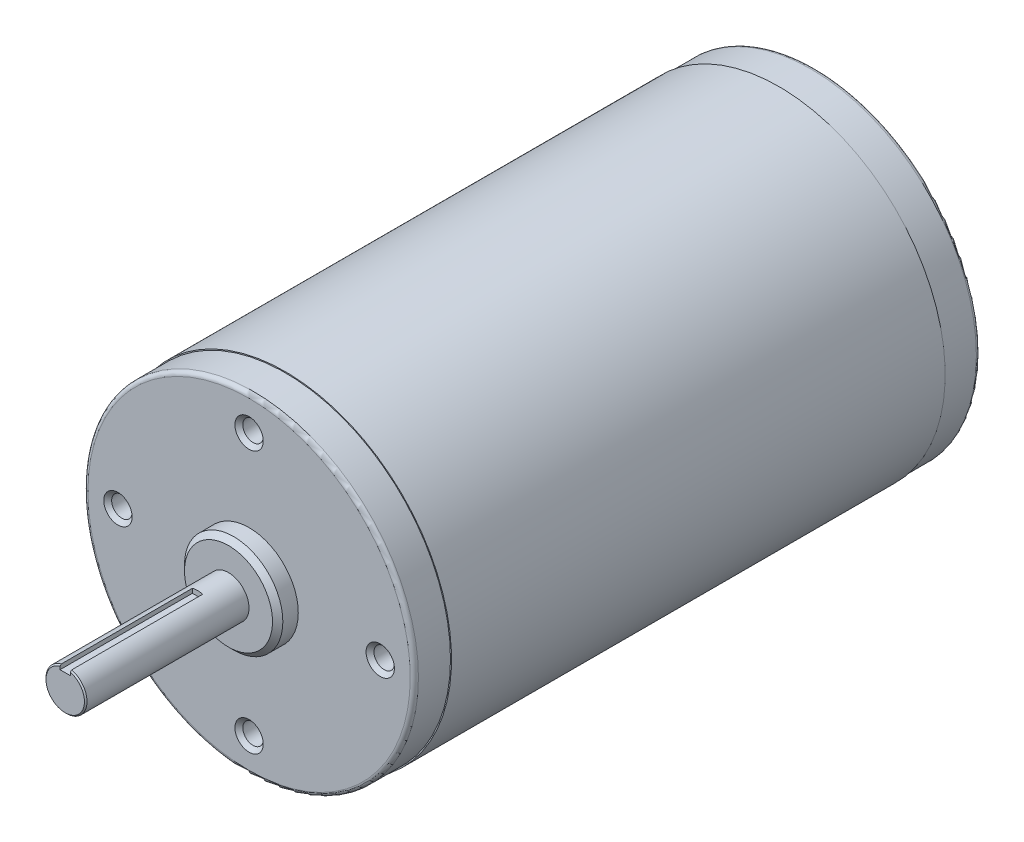
ISO-10303-21;
HEADER;
FILE_DESCRIPTION(('STEP AP214'),'2;1');
FILE_NAME('part.step','',(''),(''),'','','');
FILE_SCHEMA(('AUTOMOTIVE_DESIGN { 1 0 10303 214 1 1 1 1 }'));
ENDSEC;
DATA;
#1=APPLICATION_CONTEXT('core data for automotive mechanical design processes');
#2=APPLICATION_PROTOCOL_DEFINITION('international standard','automotive_design',2000,#1);
#3=PRODUCT_CONTEXT('',#1,'mechanical');
#4=PRODUCT('Part','Part','',(#3));
#5=PRODUCT_RELATED_PRODUCT_CATEGORY('part','',(#4));
#6=PRODUCT_DEFINITION_FORMATION('','',#4);
#7=PRODUCT_DEFINITION_CONTEXT('part definition',#1,'design');
#8=PRODUCT_DEFINITION('design','',#6,#7);
#9=PRODUCT_DEFINITION_SHAPE('','',#8);
#10=(LENGTH_UNIT() NAMED_UNIT(*) SI_UNIT(.MILLI.,.METRE.));
#11=(NAMED_UNIT(*) PLANE_ANGLE_UNIT() SI_UNIT($,.RADIAN.));
#12=(NAMED_UNIT(*) SI_UNIT($,.STERADIAN.) SOLID_ANGLE_UNIT());
#13=UNCERTAINTY_MEASURE_WITH_UNIT(LENGTH_MEASURE(1.E-05),#10,'distance_accuracy_value','');
#14=(GEOMETRIC_REPRESENTATION_CONTEXT(3) GLOBAL_UNCERTAINTY_ASSIGNED_CONTEXT((#13)) GLOBAL_UNIT_ASSIGNED_CONTEXT((#10,
#11,#12)) REPRESENTATION_CONTEXT('',''));
#15=CARTESIAN_POINT('',(0.,0.,0.));
#16=DIRECTION('',(0.,0.,1.));
#17=DIRECTION('',(1.,0.,0.));
#18=AXIS2_PLACEMENT_3D('',#15,#16,#17);
#19=CARTESIAN_POINT('',(-1.,3.,42.6108));
#20=DIRECTION('',(0.,1.,0.));
#21=DIRECTION('',(0.,0.,1.));
#22=AXIS2_PLACEMENT_3D('',#19,#20,#21);
#23=PLANE('',#22);
#24=DIRECTION('',(1.,0.,0.));
#25=VECTOR('',#24,1.);
#26=CARTESIAN_POINT('',(0.,3.,42.6108));
#27=LINE('',#26,#25);
#28=CARTESIAN_POINT('',(1.,3.,42.6108));
#29=VERTEX_POINT('',#28);
#30=CARTESIAN_POINT('',(-1.,3.,42.6107999999886));
#31=VERTEX_POINT('',#30);
#32=EDGE_CURVE('E135',#29,#31,#27,.F.);
#33=ORIENTED_EDGE('',*,*,#32,.F.);
#34=DIRECTION('',(0.,0.,1.));
#35=VECTOR('',#34,1.);
#36=CARTESIAN_POINT('',(1.,3.,42.6108));
#37=LINE('',#36,#35);
#38=CARTESIAN_POINT('',(1.,3.,16.9822));
#39=VERTEX_POINT('',#38);
#40=EDGE_CURVE('E132',#39,#29,#37,.T.);
#41=ORIENTED_EDGE('',*,*,#40,.F.);
#42=DIRECTION('',(1.,0.,0.));
#43=VECTOR('',#42,1.);
#44=CARTESIAN_POINT('',(0.,3.,16.9822));
#45=LINE('',#44,#43);
#46=CARTESIAN_POINT('',(-0.999999999999372,3.,16.9822));
#47=VERTEX_POINT('',#46);
#48=EDGE_CURVE('E112',#47,#39,#45,.T.);
#49=ORIENTED_EDGE('',*,*,#48,.F.);
#50=DIRECTION('',(0.,0.,-1.));
#51=VECTOR('',#50,1.);
#52=CARTESIAN_POINT('',(-1.,3.,42.6108));
#53=LINE('',#52,#51);
#54=EDGE_CURVE('E113',#31,#47,#53,.T.);
#55=ORIENTED_EDGE('',*,*,#54,.F.);
#56=EDGE_LOOP('',(#33,#41,#49,#55));
#57=FACE_BOUND('',#56,.T.);
#58=ADVANCED_FACE('F17',(#57),#23,.T.);
#59=CARTESIAN_POINT('',(0.,0.,42.6108));
#60=DIRECTION('',(0.,0.,1.));
#61=DIRECTION('',(1.,0.,0.));
#62=AXIS2_PLACEMENT_3D('',#59,#60,#61);
#63=PLANE('',#62);
#64=DIRECTION('',(0.,1.,0.));
#65=VECTOR('',#64,1.);
#66=CARTESIAN_POINT('',(-1.,3.84726136491921,42.6107999999829));
#67=LINE('',#66,#65);
#68=CARTESIAN_POINT('',(-1.,3.58836592481583,42.61079999998));
#69=VERTEX_POINT('',#68);
#70=EDGE_CURVE('E137',#69,#31,#67,.F.);
#71=ORIENTED_EDGE('',*,*,#70,.F.);
#72=CARTESIAN_POINT('',(0.,0.,42.6107999999772));
#73=DIRECTION('',(0.,0.,-1.));
#74=DIRECTION('',(-1.,0.,0.));
#75=AXIS2_PLACEMENT_3D('',#72,#73,#74);
#76=CIRCLE('',#75,3.72510000005377);
#77=CARTESIAN_POINT('',(1.,3.58836592480695,42.6107999999886));
#78=VERTEX_POINT('',#77);
#79=EDGE_CURVE('E108',#78,#69,#76,.T.);
#80=ORIENTED_EDGE('',*,*,#79,.F.);
#81=DIRECTION('',(0.,1.,0.));
#82=VECTOR('',#81,1.);
#83=CARTESIAN_POINT('',(1.,3.,42.6108));
#84=LINE('',#83,#82);
#85=EDGE_CURVE('E129',#29,#78,#84,.T.);
#86=ORIENTED_EDGE('',*,*,#85,.F.);
#87=ORIENTED_EDGE('',*,*,#32,.T.);
#88=EDGE_LOOP('',(#71,#80,#86,#87));
#89=FACE_BOUND('',#88,.T.);
#90=ADVANCED_FACE('F235',(#89),#63,.T.);
#91=CARTESIAN_POINT('',(-1.,3.84726136491921,42.6108));
#92=DIRECTION('',(1.,0.,0.));
#93=DIRECTION('',(0.,0.,-1.));
#94=AXIS2_PLACEMENT_3D('',#91,#92,#93);
#95=PLANE('',#94);
#96=DIRECTION('',(0.,0.,1.));
#97=VECTOR('',#96,1.);
#98=CARTESIAN_POINT('',(-0.999999999997144,3.84726136491995,10.9878));
#99=LINE('',#98,#97);
#100=CARTESIAN_POINT('',(-0.999999999998572,3.84726136492551,42.3608000000137));
#101=VERTEX_POINT('',#100);
#102=CARTESIAN_POINT('',(-0.999999999998101,3.8472613649197,16.9822));
#103=VERTEX_POINT('',#102);
#104=EDGE_CURVE('E97',#101,#103,#99,.F.);
#105=ORIENTED_EDGE('',*,*,#104,.F.);
#106=CARTESIAN_POINT('',(-1.,3.84726136493107,42.3608000000195));
#107=CARTESIAN_POINT('',(-1.,3.80416108609737,42.4025173690236));
#108=CARTESIAN_POINT('',(-1.,3.76103632691273,42.4442093866227));
#109=CARTESIAN_POINT('',(-1.,3.67473784687433,42.5275427199451));
#110=CARTESIAN_POINT('',(-1.,3.63156412601948,42.5691840356672));
#111=CARTESIAN_POINT('',(-1.,3.58836592481258,42.6107999999832));
#112=B_SPLINE_CURVE_WITH_KNOTS('',3,(#106,#107,#108,#109,#110,#111),.UNSPECIFIED.,.F.,.F.,(4,2,
4),(0.,0.179949222493419,0.35989844902044),.UNSPECIFIED.);
#113=EDGE_CURVE('E106',#101,#69,#112,.T.);
#114=ORIENTED_EDGE('',*,*,#113,.T.);
#115=ORIENTED_EDGE('',*,*,#70,.T.);
#116=ORIENTED_EDGE('',*,*,#54,.T.);
#117=DIRECTION('',(0.,-1.,0.));
#118=VECTOR('',#117,1.);
#119=CARTESIAN_POINT('',(-0.999999999999058,3.45234055060211,16.9822));
#120=LINE('',#119,#118);
#121=EDGE_CURVE('E118',#103,#47,#120,.T.);
#122=ORIENTED_EDGE('',*,*,#121,.F.);
#123=EDGE_LOOP('',(#105,#114,#115,#116,#122));
#124=FACE_BOUND('',#123,.T.);
#125=ADVANCED_FACE('F115',(#124),#95,.T.);
#126=CARTESIAN_POINT('',(0.,3.45234055060211,16.9822));
#127=DIRECTION('',(0.,0.,1.));
#128=DIRECTION('',(0.,-1.,0.));
#129=AXIS2_PLACEMENT_3D('',#126,#127,#128);
#130=PLANE('',#129);
#131=CARTESIAN_POINT('',(0.,0.,16.9822));
#132=DIRECTION('',(0.,0.,1.));
#133=DIRECTION('',(1.,0.,0.));
#134=AXIS2_PLACEMENT_3D('',#131,#132,#133);
#135=CIRCLE('',#134,3.9751);
#136=CARTESIAN_POINT('',(1.,3.84726136491921,16.9822));
#137=VERTEX_POINT('',#136);
#138=EDGE_CURVE('E120',#103,#137,#135,.F.);
#139=ORIENTED_EDGE('',*,*,#138,.F.);
#140=ORIENTED_EDGE('',*,*,#121,.T.);
#141=ORIENTED_EDGE('',*,*,#48,.T.);
#142=DIRECTION('',(0.,1.,0.));
#143=VECTOR('',#142,1.);
#144=CARTESIAN_POINT('',(1.,3.,16.9822));
#145=LINE('',#144,#143);
#146=EDGE_CURVE('E142',#137,#39,#145,.F.);
#147=ORIENTED_EDGE('',*,*,#146,.F.);
#148=EDGE_LOOP('',(#139,#140,#141,#147));
#149=FACE_BOUND('',#148,.T.);
#150=ADVANCED_FACE('F228',(#149),#130,.T.);
#151=CARTESIAN_POINT('',(1.,3.,42.6108));
#152=DIRECTION('',(-1.,0.,0.));
#153=DIRECTION('',(0.,0.,1.));
#154=AXIS2_PLACEMENT_3D('',#151,#152,#153);
#155=PLANE('',#154);
#156=ORIENTED_EDGE('',*,*,#85,.T.);
#157=CARTESIAN_POINT('',(1.,3.84726136494984,42.3608000000013));
#158=CARTESIAN_POINT('',(1.,3.80416108611283,42.4025173690086));
#159=CARTESIAN_POINT('',(1.,3.76103632692487,42.444209386611));
#160=CARTESIAN_POINT('',(1.,3.67473784687983,42.5275427199398));
#161=CARTESIAN_POINT('',(1.,3.63156412602165,42.5691840356651));
#162=CARTESIAN_POINT('',(1.,3.58836592481142,42.6107999999843));
#163=B_SPLINE_CURVE_WITH_KNOTS('',3,(#157,#158,#159,#160,#161,#162),.UNSPECIFIED.,.F.,.F.,(4,2,
4),(0.,0.179949222507292,0.359898449048175),.UNSPECIFIED.);
#164=CARTESIAN_POINT('',(1.,3.84726136493452,42.3608000000032));
#165=VERTEX_POINT('',#164);
#166=EDGE_CURVE('E121',#165,#78,#163,.T.);
#167=ORIENTED_EDGE('',*,*,#166,.F.);
#168=DIRECTION('',(0.,0.,1.));
#169=VECTOR('',#168,1.);
#170=CARTESIAN_POINT('',(1.,3.84726136491921,10.9878));
#171=LINE('',#170,#169);
#172=EDGE_CURVE('E99',#137,#165,#171,.T.);
#173=ORIENTED_EDGE('',*,*,#172,.F.);
#174=ORIENTED_EDGE('',*,*,#146,.T.);
#175=ORIENTED_EDGE('',*,*,#40,.T.);
#176=EDGE_LOOP('',(#156,#167,#173,#174,#175));
#177=FACE_BOUND('',#176,.T.);
#178=ADVANCED_FACE('F224',(#177),#155,.T.);
#179=CARTESIAN_POINT('',(0.,0.,42.3608000000399));
#180=DIRECTION('',(0.,0.,-1.));
#181=DIRECTION('',(-1.,0.,0.));
#182=AXIS2_PLACEMENT_3D('',#179,#180,#181);
#183=CONICAL_SURFACE('',#182,3.97509999999102,0.785398163397448);
#184=CARTESIAN_POINT('',(0.,0.,42.3608000000051));
#185=DIRECTION('',(0.,0.,1.));
#186=DIRECTION('',(1.,0.,0.));
#187=AXIS2_PLACEMENT_3D('',#184,#185,#186);
#188=CIRCLE('',#187,3.9751);
#189=EDGE_CURVE('E91',#165,#101,#188,.F.);
#190=ORIENTED_EDGE('',*,*,#189,.F.);
#191=ORIENTED_EDGE('',*,*,#166,.T.);
#192=ORIENTED_EDGE('',*,*,#79,.T.);
#193=ORIENTED_EDGE('',*,*,#113,.F.);
#194=EDGE_LOOP('',(#190,#191,#192,#193));
#195=FACE_BOUND('',#194,.T.);
#196=ADVANCED_FACE('F107',(#195),#183,.T.);
#197=CARTESIAN_POINT('',(0.,0.,10.9878));
#198=DIRECTION('',(0.,0.,1.));
#199=DIRECTION('',(1.,0.,0.));
#200=AXIS2_PLACEMENT_3D('',#197,#198,#199);
#201=CYLINDRICAL_SURFACE('',#200,3.9751);
#202=ORIENTED_EDGE('',*,*,#189,.T.);
#203=ORIENTED_EDGE('',*,*,#104,.T.);
#204=ORIENTED_EDGE('',*,*,#138,.T.);
#205=ORIENTED_EDGE('',*,*,#172,.T.);
#206=EDGE_LOOP('',(#202,#203,#204,#205));
#207=FACE_BOUND('',#206,.T.);
#208=CARTESIAN_POINT('',(0.,0.,10.9878));
#209=DIRECTION('',(0.,0.,1.));
#210=DIRECTION('',(1.,0.,0.));
#211=AXIS2_PLACEMENT_3D('',#208,#209,#210);
#212=CIRCLE('',#211,3.9751);
#213=CARTESIAN_POINT('',(3.9751,0.,10.9878));
#214=VERTEX_POINT('',#213);
#215=EDGE_CURVE('E214',#214,#214,#212,.F.);
#216=ORIENTED_EDGE('',*,*,#215,.F.);
#217=EDGE_LOOP('',(#216));
#218=FACE_BOUND('',#217,.T.);
#219=ADVANCED_FACE('F93',(#207,#218),#201,.T.);
#220=CARTESIAN_POINT('',(0.,-25.4,-98.7956));
#221=DIRECTION('',(0.,0.,-1.));
#222=DIRECTION('',(-1.,0.,0.));
#223=AXIS2_PLACEMENT_3D('',#220,#221,#222);
#224=CYLINDRICAL_SURFACE('',#223,2.54);
#225=CARTESIAN_POINT('',(0.,-25.4,-94.9856000000295));
#226=DIRECTION('',(0.,0.,-1.));
#227=DIRECTION('',(0.,1.,0.));
#228=AXIS2_PLACEMENT_3D('',#225,#226,#227);
#229=CIRCLE('',#228,2.54000000013357);
#230=CARTESIAN_POINT('',(0.,-22.8599999998664,-94.9856000000295));
#231=VERTEX_POINT('',#230);
#232=EDGE_CURVE('E213',#231,#231,#229,.F.);
#233=ORIENTED_EDGE('',*,*,#232,.T.);
#234=EDGE_LOOP('',(#233));
#235=FACE_BOUND('',#234,.T.);
#236=CARTESIAN_POINT('',(0.,-25.4,-98.0336));
#237=DIRECTION('',(0.,0.,-1.));
#238=DIRECTION('',(-1.,0.,0.));
#239=AXIS2_PLACEMENT_3D('',#236,#237,#238);
#240=CIRCLE('',#239,2.54);
#241=CARTESIAN_POINT('',(-2.54,-25.4,-98.0336));
#242=VERTEX_POINT('',#241);
#243=EDGE_CURVE('E210',#242,#242,#240,.T.);
#244=ORIENTED_EDGE('',*,*,#243,.T.);
#245=EDGE_LOOP('',(#244));
#246=FACE_BOUND('',#245,.T.);
#247=ADVANCED_FACE('F734',(#235,#246),#224,.F.);
#248=CARTESIAN_POINT('',(0.,25.4,-98.7956));
#249=DIRECTION('',(0.,0.,-1.));
#250=DIRECTION('',(-1.,0.,0.));
#251=AXIS2_PLACEMENT_3D('',#248,#249,#250);
#252=CYLINDRICAL_SURFACE('',#251,2.54);
#253=CARTESIAN_POINT('',(0.,25.4,-94.9855999999727));
#254=DIRECTION('',(0.,0.,-1.));
#255=DIRECTION('',(-1.,0.,0.));
#256=AXIS2_PLACEMENT_3D('',#253,#254,#255);
#257=CIRCLE('',#256,2.53999999995358);
#258=CARTESIAN_POINT('',(-2.53999999995358,25.4,-94.9855999999727));
#259=VERTEX_POINT('',#258);
#260=EDGE_CURVE('E102',#259,#259,#257,.F.);
#261=ORIENTED_EDGE('',*,*,#260,.T.);
#262=EDGE_LOOP('',(#261));
#263=FACE_BOUND('',#262,.T.);
#264=CARTESIAN_POINT('',(0.,25.4,-98.0336));
#265=DIRECTION('',(0.,0.,-1.));
#266=DIRECTION('',(-1.,0.,0.));
#267=AXIS2_PLACEMENT_3D('',#264,#265,#266);
#268=CIRCLE('',#267,2.54);
#269=CARTESIAN_POINT('',(-2.54,25.4,-98.0336));
#270=VERTEX_POINT('',#269);
#271=EDGE_CURVE('E207',#270,#270,#268,.T.);
#272=ORIENTED_EDGE('',*,*,#271,.T.);
#273=EDGE_LOOP('',(#272));
#274=FACE_BOUND('',#273,.T.);
#275=ADVANCED_FACE('F725',(#263,#274),#252,.F.);
#276=CARTESIAN_POINT('',(0.,25.4,-94.9855999999727));
#277=DIRECTION('',(0.,0.,-1.));
#278=DIRECTION('',(0.,1.,0.));
#279=AXIS2_PLACEMENT_3D('',#276,#277,#278);
#280=CONICAL_SURFACE('',#279,2.53999999995358,1.02974425872309);
#281=CARTESIAN_POINT('',(0.,25.4,-94.6498390860874));
#282=DIRECTION('',(0.,0.,1.));
#283=DIRECTION('',(1.,0.,0.));
#284=AXIS2_PLACEMENT_3D('',#281,#282,#283);
#285=CIRCLE('',#284,1.9812);
#286=CARTESIAN_POINT('',(1.98120000000001,25.4,-94.6498390860874));
#287=VERTEX_POINT('',#286);
#288=EDGE_CURVE('E206',#287,#287,#285,.T.);
#289=ORIENTED_EDGE('',*,*,#288,.T.);
#290=EDGE_LOOP('',(#289));
#291=FACE_BOUND('',#290,.T.);
#292=ORIENTED_EDGE('',*,*,#260,.F.);
#293=EDGE_LOOP('',(#292));
#294=FACE_BOUND('',#293,.T.);
#295=ADVANCED_FACE('F716',(#291,#294),#280,.F.);
#296=CARTESIAN_POINT('',(0.,0.,-95.6056));
#297=DIRECTION('',(0.,0.,1.));
#298=DIRECTION('',(1.,0.,0.));
#299=AXIS2_PLACEMENT_3D('',#296,#297,#298);
#300=PLANE('',#299);
#301=CARTESIAN_POINT('',(25.4,0.,-95.6056));
#302=DIRECTION('',(0.,0.,1.));
#303=DIRECTION('',(1.,0.,0.));
#304=AXIS2_PLACEMENT_3D('',#301,#302,#303);
#305=CIRCLE('',#304,1.9812);
#306=CARTESIAN_POINT('',(27.3812,0.,-95.6056));
#307=VERTEX_POINT('',#306);
#308=EDGE_CURVE('E203',#307,#307,#305,.T.);
#309=ORIENTED_EDGE('',*,*,#308,.T.);
#310=EDGE_LOOP('',(#309));
#311=FACE_BOUND('',#310,.T.);
#312=ADVANCED_FACE('F707',(#311),#300,.T.);
#313=CARTESIAN_POINT('',(0.,0.,10.9878));
#314=DIRECTION('',(0.,0.,1.));
#315=DIRECTION('',(1.,0.,0.));
#316=AXIS2_PLACEMENT_3D('',#313,#314,#315);
#317=PLANE('',#316);
#318=CARTESIAN_POINT('',(0.,0.,10.9878));
#319=DIRECTION('',(0.,0.,-1.));
#320=DIRECTION('',(-1.,0.,0.));
#321=AXIS2_PLACEMENT_3D('',#318,#319,#320);
#322=CIRCLE('',#321,8.525);
#323=CARTESIAN_POINT('',(-8.525,0.,10.9878));
#324=VERTEX_POINT('',#323);
#325=EDGE_CURVE('E199',#324,#324,#322,.T.);
#326=ORIENTED_EDGE('',*,*,#325,.F.);
#327=EDGE_LOOP('',(#326));
#328=FACE_BOUND('',#327,.T.);
#329=ORIENTED_EDGE('',*,*,#215,.T.);
#330=EDGE_LOOP('',(#329));
#331=FACE_BOUND('',#330,.T.);
#332=ADVANCED_FACE('F698',(#328,#331),#317,.T.);
#333=CARTESIAN_POINT('',(0.,-25.4,-94.9856000000295));
#334=DIRECTION('',(0.,0.,-1.));
#335=DIRECTION('',(0.,1.,0.));
#336=AXIS2_PLACEMENT_3D('',#333,#334,#335);
#337=CONICAL_SURFACE('',#336,2.54000000013357,1.02974425854376);
#338=ORIENTED_EDGE('',*,*,#232,.F.);
#339=EDGE_LOOP('',(#338));
#340=FACE_BOUND('',#339,.T.);
#341=CARTESIAN_POINT('',(0.,-25.4,-94.6498390860874));
#342=DIRECTION('',(0.,0.,1.));
#343=DIRECTION('',(1.,0.,0.));
#344=AXIS2_PLACEMENT_3D('',#341,#342,#343);
#345=CIRCLE('',#344,1.9812);
#346=CARTESIAN_POINT('',(1.98119999999999,-25.4,-94.6498390860874));
#347=VERTEX_POINT('',#346);
#348=EDGE_CURVE('E202',#347,#347,#345,.T.);
#349=ORIENTED_EDGE('',*,*,#348,.T.);
#350=EDGE_LOOP('',(#349));
#351=FACE_BOUND('',#350,.T.);
#352=ADVANCED_FACE('F689',(#340,#351),#337,.F.);
#353=CARTESIAN_POINT('',(-25.3999999999998,0.,-4.17600000008633));
#354=DIRECTION('',(0.,0.,1.));
#355=DIRECTION('',(1.,0.,0.));
#356=AXIS2_PLACEMENT_3D('',#353,#354,#355);
#357=CONICAL_SURFACE('',#356,1.98119999977069,1.04719755100855);
#358=CARTESIAN_POINT('',(-25.3999999998484,0.,-5.31984635355798));
#359=VERTEX_POINT('',#358);
#360=VERTEX_LOOP('',#359);
#361=FACE_BOUND('',#360,.T.);
#362=CARTESIAN_POINT('',(-25.4,0.,-4.176));
#363=DIRECTION('',(0.,0.,1.));
#364=DIRECTION('',(1.,0.,0.));
#365=AXIS2_PLACEMENT_3D('',#362,#363,#364);
#366=CIRCLE('',#365,1.9812);
#367=CARTESIAN_POINT('',(-23.4188,0.,-4.176));
#368=VERTEX_POINT('',#367);
#369=EDGE_CURVE('E198',#368,#368,#366,.T.);
#370=ORIENTED_EDGE('',*,*,#369,.T.);
#371=EDGE_LOOP('',(#370));
#372=FACE_BOUND('',#371,.T.);
#373=ADVANCED_FACE('F680',(#361,#372),#357,.F.);
#374=CARTESIAN_POINT('',(0.,-25.4,-98.0336));
#375=DIRECTION('',(0.,0.,1.));
#376=DIRECTION('',(1.,0.,0.));
#377=AXIS2_PLACEMENT_3D('',#374,#375,#376);
#378=PLANE('',#377);
#379=ORIENTED_EDGE('',*,*,#243,.F.);
#380=EDGE_LOOP('',(#379));
#381=FACE_BOUND('',#380,.T.);
#382=CARTESIAN_POINT('',(0.,-25.4,-98.0336));
#383=DIRECTION('',(0.,0.,-1.));
#384=DIRECTION('',(-1.,0.,0.));
#385=AXIS2_PLACEMENT_3D('',#382,#383,#384);
#386=CIRCLE('',#385,4.953);
#387=CARTESIAN_POINT('',(-4.953,-25.4,-98.0336));
#388=VERTEX_POINT('',#387);
#389=EDGE_CURVE('E194',#388,#388,#386,.T.);
#390=ORIENTED_EDGE('',*,*,#389,.T.);
#391=EDGE_LOOP('',(#390));
#392=FACE_BOUND('',#391,.T.);
#393=ADVANCED_FACE('F671',(#381,#392),#378,.F.);
#394=CARTESIAN_POINT('',(0.,0.,-106.7204));
#395=DIRECTION('',(0.,0.,-1.));
#396=DIRECTION('',(-1.,0.,0.));
#397=AXIS2_PLACEMENT_3D('',#394,#395,#396);
#398=PLANE('',#397);
#399=CARTESIAN_POINT('',(0.,0.,-106.7204));
#400=DIRECTION('',(0.,0.,1.));
#401=DIRECTION('',(0.,-1.,0.));
#402=AXIS2_PLACEMENT_3D('',#399,#400,#401);
#403=CIRCLE('',#402,14.3129);
#404=CARTESIAN_POINT('',(0.,-14.3129,-106.7204));
#405=VERTEX_POINT('',#404);
#406=CARTESIAN_POINT('',(0.,14.3129,-106.7204));
#407=VERTEX_POINT('',#406);
#408=EDGE_CURVE('E197',#405,#407,#403,.T.);
#409=ORIENTED_EDGE('',*,*,#408,.F.);
#410=CARTESIAN_POINT('',(0.,0.,-106.7204));
#411=DIRECTION('',(0.,0.,1.));
#412=DIRECTION('',(0.,1.,0.));
#413=AXIS2_PLACEMENT_3D('',#410,#411,#412);
#414=CIRCLE('',#413,14.3129);
#415=EDGE_CURVE('E193',#407,#405,#414,.T.);
#416=ORIENTED_EDGE('',*,*,#415,.F.);
#417=EDGE_LOOP('',(#409,#416));
#418=FACE_BOUND('',#417,.T.);
#419=ADVANCED_FACE('F662',(#418),#398,.T.);
#420=CARTESIAN_POINT('',(0.,25.4,-98.0336));
#421=DIRECTION('',(0.,0.,1.));
#422=DIRECTION('',(1.,0.,0.));
#423=AXIS2_PLACEMENT_3D('',#420,#421,#422);
#424=PLANE('',#423);
#425=ORIENTED_EDGE('',*,*,#271,.F.);
#426=EDGE_LOOP('',(#425));
#427=FACE_BOUND('',#426,.T.);
#428=CARTESIAN_POINT('',(0.,25.4,-98.0336));
#429=DIRECTION('',(0.,0.,-1.));
#430=DIRECTION('',(-1.,0.,0.));
#431=AXIS2_PLACEMENT_3D('',#428,#429,#430);
#432=CIRCLE('',#431,4.953);
#433=CARTESIAN_POINT('',(-4.953,25.4,-98.0336));
#434=VERTEX_POINT('',#433);
#435=EDGE_CURVE('E189',#434,#434,#432,.T.);
#436=ORIENTED_EDGE('',*,*,#435,.T.);
#437=EDGE_LOOP('',(#436));
#438=FACE_BOUND('',#437,.T.);
#439=ADVANCED_FACE('F653',(#427,#438),#424,.F.);
#440=CARTESIAN_POINT('',(0.,25.4,-84.1854148251792));
#441=DIRECTION('',(0.,0.,1.));
#442=DIRECTION('',(1.,0.,0.));
#443=AXIS2_PLACEMENT_3D('',#440,#441,#442);
#444=CYLINDRICAL_SURFACE('',#443,1.9812);
#445=ORIENTED_EDGE('',*,*,#288,.F.);
#446=EDGE_LOOP('',(#445));
#447=FACE_BOUND('',#446,.T.);
#448=CARTESIAN_POINT('',(0.,25.4,6.23799999999619));
#449=DIRECTION('',(0.,0.,1.));
#450=DIRECTION('',(1.,0.,0.));
#451=AXIS2_PLACEMENT_3D('',#448,#449,#450);
#452=CIRCLE('',#451,1.9811999999888);
#453=CARTESIAN_POINT('',(1.9811999999888,25.4,6.23799999999619));
#454=VERTEX_POINT('',#453);
#455=EDGE_CURVE('E192',#454,#454,#452,.T.);
#456=ORIENTED_EDGE('',*,*,#455,.T.);
#457=EDGE_LOOP('',(#456));
#458=FACE_BOUND('',#457,.T.);
#459=ADVANCED_FACE('F644',(#447,#458),#444,.F.);
#460=CARTESIAN_POINT('',(25.4,0.,-84.1854148251792));
#461=DIRECTION('',(0.,0.,1.));
#462=DIRECTION('',(1.,0.,0.));
#463=AXIS2_PLACEMENT_3D('',#460,#461,#462);
#464=CYLINDRICAL_SURFACE('',#463,1.9812);
#465=ORIENTED_EDGE('',*,*,#308,.F.);
#466=EDGE_LOOP('',(#465));
#467=FACE_BOUND('',#466,.T.);
#468=CARTESIAN_POINT('',(25.4,0.,6.23800000010988));
#469=DIRECTION('',(0.,0.,1.));
#470=DIRECTION('',(1.,0.,0.));
#471=AXIS2_PLACEMENT_3D('',#468,#469,#470);
#472=CIRCLE('',#471,1.98119999997934);
#473=CARTESIAN_POINT('',(27.3811999999793,0.,6.23800000010988));
#474=VERTEX_POINT('',#473);
#475=EDGE_CURVE('E856',#474,#474,#472,.T.);
#476=ORIENTED_EDGE('',*,*,#475,.T.);
#477=EDGE_LOOP('',(#476));
#478=FACE_BOUND('',#477,.T.);
#479=ADVANCED_FACE('F635',(#467,#478),#464,.F.);
#480=CARTESIAN_POINT('',(0.,0.,9.9878));
#481=DIRECTION('',(0.,0.,-1.));
#482=DIRECTION('',(-1.,0.,0.));
#483=AXIS2_PLACEMENT_3D('',#480,#481,#482);
#484=CONICAL_SURFACE('',#483,9.525,0.785398163397449);
#485=CARTESIAN_POINT('',(0.,0.,9.9878));
#486=DIRECTION('',(0.,0.,1.));
#487=DIRECTION('',(1.,0.,0.));
#488=AXIS2_PLACEMENT_3D('',#485,#486,#487);
#489=CIRCLE('',#488,9.525);
#490=CARTESIAN_POINT('',(9.525,0.,9.9878));
#491=VERTEX_POINT('',#490);
#492=EDGE_CURVE('E859',#491,#491,#489,.F.);
#493=ORIENTED_EDGE('',*,*,#492,.F.);
#494=EDGE_LOOP('',(#493));
#495=FACE_BOUND('',#494,.T.);
#496=ORIENTED_EDGE('',*,*,#325,.T.);
#497=EDGE_LOOP('',(#496));
#498=FACE_BOUND('',#497,.T.);
#499=ADVANCED_FACE('F626',(#495,#498),#484,.T.);
#500=CARTESIAN_POINT('',(0.,-25.4,-84.1854148251792));
#501=DIRECTION('',(0.,0.,1.));
#502=DIRECTION('',(1.,0.,0.));
#503=AXIS2_PLACEMENT_3D('',#500,#501,#502);
#504=CYLINDRICAL_SURFACE('',#503,1.9812);
#505=ORIENTED_EDGE('',*,*,#348,.F.);
#506=EDGE_LOOP('',(#505));
#507=FACE_BOUND('',#506,.T.);
#508=CARTESIAN_POINT('',(0.,-25.4,6.23799999993935));
#509=DIRECTION('',(0.,0.,1.));
#510=DIRECTION('',(1.,0.,0.));
#511=AXIS2_PLACEMENT_3D('',#508,#509,#510);
#512=CIRCLE('',#511,1.98120000004565);
#513=CARTESIAN_POINT('',(1.98120000004565,-25.4,6.23799999993935));
#514=VERTEX_POINT('',#513);
#515=EDGE_CURVE('E862',#514,#514,#512,.T.);
#516=ORIENTED_EDGE('',*,*,#515,.T.);
#517=EDGE_LOOP('',(#516));
#518=FACE_BOUND('',#517,.T.);
#519=ADVANCED_FACE('F618',(#507,#518),#504,.F.);
#520=CARTESIAN_POINT('',(-25.4,0.,-84.1854148251792));
#521=DIRECTION('',(0.,0.,1.));
#522=DIRECTION('',(1.,0.,0.));
#523=AXIS2_PLACEMENT_3D('',#520,#521,#522);
#524=CYLINDRICAL_SURFACE('',#523,1.9812);
#525=ORIENTED_EDGE('',*,*,#369,.F.);
#526=EDGE_LOOP('',(#525));
#527=FACE_BOUND('',#526,.T.);
#528=CARTESIAN_POINT('',(-25.4,0.,6.23800000005303));
#529=DIRECTION('',(0.,0.,1.));
#530=DIRECTION('',(0.,-1.,0.));
#531=AXIS2_PLACEMENT_3D('',#528,#529,#530);
#532=CIRCLE('',#531,1.98120000004565);
#533=CARTESIAN_POINT('',(-25.4,-1.98120000004565,6.23800000005303));
#534=VERTEX_POINT('',#533);
#535=EDGE_CURVE('E864',#534,#534,#532,.T.);
#536=ORIENTED_EDGE('',*,*,#535,.T.);
#537=EDGE_LOOP('',(#536));
#538=FACE_BOUND('',#537,.T.);
#539=ADVANCED_FACE('F610',(#527,#538),#524,.F.);
#540=CARTESIAN_POINT('',(0.,-25.4,-100.3196));
#541=DIRECTION('',(0.,0.,-1.));
#542=DIRECTION('',(-1.,0.,0.));
#543=AXIS2_PLACEMENT_3D('',#540,#541,#542);
#544=CYLINDRICAL_SURFACE('',#543,4.953);
#545=ORIENTED_EDGE('',*,*,#389,.F.);
#546=EDGE_LOOP('',(#545));
#547=FACE_BOUND('',#546,.T.);
#548=CARTESIAN_POINT('',(0.,-25.4,-102.097599999979));
#549=DIRECTION('',(0.,0.,-1.));
#550=DIRECTION('',(-1.,0.,0.));
#551=AXIS2_PLACEMENT_3D('',#548,#549,#550);
#552=CIRCLE('',#551,4.95300000005727);
#553=CARTESIAN_POINT('',(-4.95300000005727,-25.4,-102.097599999979));
#554=VERTEX_POINT('',#553);
#555=EDGE_CURVE('E378',#554,#554,#552,.T.);
#556=ORIENTED_EDGE('',*,*,#555,.T.);
#557=EDGE_LOOP('',(#556));
#558=FACE_BOUND('',#557,.T.);
#559=ADVANCED_FACE('F388',(#547,#558),#544,.F.);
#560=CARTESIAN_POINT('',(0.,0.,-105.9584));
#561=DIRECTION('',(0.,0.,1.));
#562=DIRECTION('',(0.,-1.,0.));
#563=AXIS2_PLACEMENT_3D('',#560,#561,#562);
#564=TOROIDAL_SURFACE('',#563,14.3129,0.762000000000005);
#565=ORIENTED_EDGE('',*,*,#408,.T.);
#566=ORIENTED_EDGE('',*,*,#415,.T.);
#567=EDGE_LOOP('',(#565,#566));
#568=FACE_BOUND('',#567,.T.);
#569=CARTESIAN_POINT('',(0.,0.,-105.9584));
#570=DIRECTION('',(0.,0.,-1.));
#571=DIRECTION('',(-1.,0.,0.));
#572=AXIS2_PLACEMENT_3D('',#569,#570,#571);
#573=CIRCLE('',#572,15.0749);
#574=CARTESIAN_POINT('',(-15.0749,0.,-105.9584));
#575=VERTEX_POINT('',#574);
#576=EDGE_CURVE('E375',#575,#575,#573,.F.);
#577=ORIENTED_EDGE('',*,*,#576,.F.);
#578=EDGE_LOOP('',(#577));
#579=FACE_BOUND('',#578,.T.);
#580=ADVANCED_FACE('F382',(#568,#579),#564,.T.);
#581=CARTESIAN_POINT('',(0.,25.4,-100.3196));
#582=DIRECTION('',(0.,0.,-1.));
#583=DIRECTION('',(-1.,0.,0.));
#584=AXIS2_PLACEMENT_3D('',#581,#582,#583);
#585=CYLINDRICAL_SURFACE('',#584,4.953);
#586=ORIENTED_EDGE('',*,*,#435,.F.);
#587=EDGE_LOOP('',(#586));
#588=FACE_BOUND('',#587,.T.);
#589=CARTESIAN_POINT('',(0.,25.4,-102.097600000036));
#590=DIRECTION('',(0.,0.,-1.));
#591=DIRECTION('',(-1.,0.,0.));
#592=AXIS2_PLACEMENT_3D('',#589,#590,#591);
#593=CIRCLE('',#592,4.95300000000043);
#594=CARTESIAN_POINT('',(-4.95300000000043,25.4,-102.097600000036));
#595=VERTEX_POINT('',#594);
#596=EDGE_CURVE('E188',#595,#595,#593,.T.);
#597=ORIENTED_EDGE('',*,*,#596,.T.);
#598=EDGE_LOOP('',(#597));
#599=FACE_BOUND('',#598,.T.);
#600=ADVANCED_FACE('F387',(#588,#599),#585,.F.);
#601=CARTESIAN_POINT('',(0.,25.4,7.000000000005));
#602=DIRECTION('',(0.,0.,1.));
#603=DIRECTION('',(0.,-1.,0.));
#604=AXIS2_PLACEMENT_3D('',#601,#602,#603);
#605=CONICAL_SURFACE('',#604,2.74320000005445,0.785398163434747);
#606=ORIENTED_EDGE('',*,*,#455,.F.);
#607=EDGE_LOOP('',(#606));
#608=FACE_BOUND('',#607,.T.);
#609=CARTESIAN_POINT('',(0.,25.4,6.99999999994817));
#610=DIRECTION('',(0.,0.,1.));
#611=DIRECTION('',(0.,-1.,0.));
#612=AXIS2_PLACEMENT_3D('',#609,#610,#611);
#613=CIRCLE('',#612,2.74319999999761);
#614=CARTESIAN_POINT('',(0.,22.6568000000024,6.99999999994817));
#615=VERTEX_POINT('',#614);
#616=EDGE_CURVE('E185',#615,#615,#613,.F.);
#617=ORIENTED_EDGE('',*,*,#616,.F.);
#618=EDGE_LOOP('',(#617));
#619=FACE_BOUND('',#618,.T.);
#620=ADVANCED_FACE('F582',(#608,#619),#605,.F.);
#621=CARTESIAN_POINT('',(25.4,0.,7.00000000011869));
#622=DIRECTION('',(0.,0.,1.));
#623=DIRECTION('',(0.,-1.,0.));
#624=AXIS2_PLACEMENT_3D('',#621,#622,#623);
#625=CONICAL_SURFACE('',#624,2.74320000004499,0.785398163434747);
#626=ORIENTED_EDGE('',*,*,#475,.F.);
#627=EDGE_LOOP('',(#626));
#628=FACE_BOUND('',#627,.T.);
#629=CARTESIAN_POINT('',(25.4,0.,7.00000000012815));
#630=DIRECTION('',(0.,0.,1.));
#631=DIRECTION('',(0.,-1.,0.));
#632=AXIS2_PLACEMENT_3D('',#629,#630,#631);
#633=CIRCLE('',#632,2.74320000005446);
#634=CARTESIAN_POINT('',(25.4,-2.74320000005446,7.00000000012815));
#635=VERTEX_POINT('',#634);
#636=EDGE_CURVE('E182',#635,#635,#633,.F.);
#637=ORIENTED_EDGE('',*,*,#636,.F.);
#638=EDGE_LOOP('',(#637));
#639=FACE_BOUND('',#638,.T.);
#640=ADVANCED_FACE('F573',(#628,#639),#625,.F.);
#641=CARTESIAN_POINT('',(0.,0.,7.));
#642=DIRECTION('',(0.,0.,1.));
#643=DIRECTION('',(1.,0.,0.));
#644=AXIS2_PLACEMENT_3D('',#641,#642,#643);
#645=CYLINDRICAL_SURFACE('',#644,9.525);
#646=ORIENTED_EDGE('',*,*,#492,.T.);
#647=EDGE_LOOP('',(#646));
#648=FACE_BOUND('',#647,.T.);
#649=CARTESIAN_POINT('',(0.,0.,7.));
#650=DIRECTION('',(0.,0.,1.));
#651=DIRECTION('',(1.,0.,0.));
#652=AXIS2_PLACEMENT_3D('',#649,#650,#651);
#653=CIRCLE('',#652,9.525);
#654=CARTESIAN_POINT('',(9.525,0.,7.));
#655=VERTEX_POINT('',#654);
#656=EDGE_CURVE('E179',#655,#655,#653,.F.);
#657=ORIENTED_EDGE('',*,*,#656,.F.);
#658=EDGE_LOOP('',(#657));
#659=FACE_BOUND('',#658,.T.);
#660=ADVANCED_FACE('F564',(#648,#659),#645,.T.);
#661=CARTESIAN_POINT('',(0.,-25.4,7.00000000011869));
#662=DIRECTION('',(0.,0.,1.));
#663=DIRECTION('',(0.,-1.,0.));
#664=AXIS2_PLACEMENT_3D('',#661,#662,#663);
#665=CONICAL_SURFACE('',#664,2.74320000016815,0.785398163360149);
#666=ORIENTED_EDGE('',*,*,#515,.F.);
#667=EDGE_LOOP('',(#666));
#668=FACE_BOUND('',#667,.T.);
#669=CARTESIAN_POINT('',(0.,-25.4,7.00000000011869));
#670=DIRECTION('',(0.,0.,1.));
#671=DIRECTION('',(0.,-1.,0.));
#672=AXIS2_PLACEMENT_3D('',#669,#670,#671);
#673=CIRCLE('',#672,2.74320000016815);
#674=CARTESIAN_POINT('',(0.,-28.1432000001682,7.00000000011869));
#675=VERTEX_POINT('',#674);
#676=EDGE_CURVE('E176',#675,#675,#673,.F.);
#677=ORIENTED_EDGE('',*,*,#676,.F.);
#678=EDGE_LOOP('',(#677));
#679=FACE_BOUND('',#678,.T.);
#680=ADVANCED_FACE('F555',(#668,#679),#665,.F.);
#681=CARTESIAN_POINT('',(-25.4,0.,7.000000000005));
#682=DIRECTION('',(0.,0.,1.));
#683=DIRECTION('',(0.,-1.,0.));
#684=AXIS2_PLACEMENT_3D('',#681,#682,#683);
#685=CONICAL_SURFACE('',#684,2.74319999999762,0.785398163397449);
#686=ORIENTED_EDGE('',*,*,#535,.F.);
#687=EDGE_LOOP('',(#686));
#688=FACE_BOUND('',#687,.T.);
#689=CARTESIAN_POINT('',(-25.4,0.,7.00000000006184));
#690=DIRECTION('',(0.,0.,1.));
#691=DIRECTION('',(0.,-1.,0.));
#692=AXIS2_PLACEMENT_3D('',#689,#690,#691);
#693=CIRCLE('',#692,2.74320000005446);
#694=CARTESIAN_POINT('',(-25.4,-2.74320000005445,7.00000000006184));
#695=VERTEX_POINT('',#694);
#696=EDGE_CURVE('E173',#695,#695,#693,.F.);
#697=ORIENTED_EDGE('',*,*,#696,.F.);
#698=EDGE_LOOP('',(#697));
#699=FACE_BOUND('',#698,.T.);
#700=ADVANCED_FACE('F546',(#688,#699),#685,.F.);
#701=CARTESIAN_POINT('',(0.,-25.4,-102.605599999947));
#702=DIRECTION('',(0.,0.,-1.));
#703=DIRECTION('',(-1.,0.,0.));
#704=AXIS2_PLACEMENT_3D('',#701,#702,#703);
#705=CONICAL_SURFACE('',#704,5.46099999996841,0.7853981633415);
#706=ORIENTED_EDGE('',*,*,#555,.F.);
#707=EDGE_LOOP('',(#706));
#708=FACE_BOUND('',#707,.T.);
#709=CARTESIAN_POINT('',(0.,-25.4,-102.605599999947));
#710=DIRECTION('',(0.,0.,-1.));
#711=DIRECTION('',(-1.,0.,0.));
#712=AXIS2_PLACEMENT_3D('',#709,#710,#711);
#713=CIRCLE('',#712,5.46099999996841);
#714=CARTESIAN_POINT('',(-5.46099999996841,-25.4,-102.605599999947));
#715=VERTEX_POINT('',#714);
#716=EDGE_CURVE('E170',#715,#715,#713,.F.);
#717=ORIENTED_EDGE('',*,*,#716,.F.);
#718=EDGE_LOOP('',(#717));
#719=FACE_BOUND('',#718,.T.);
#720=ADVANCED_FACE('F537',(#708,#719),#705,.F.);
#721=CARTESIAN_POINT('',(0.,0.,-102.6056));
#722=DIRECTION('',(0.,0.,-1.));
#723=DIRECTION('',(-1.,0.,0.));
#724=AXIS2_PLACEMENT_3D('',#721,#722,#723);
#725=CYLINDRICAL_SURFACE('',#724,15.0749);
#726=ORIENTED_EDGE('',*,*,#576,.T.);
#727=EDGE_LOOP('',(#726));
#728=FACE_BOUND('',#727,.T.);
#729=CARTESIAN_POINT('',(0.,0.,-102.6056));
#730=DIRECTION('',(0.,0.,-1.));
#731=DIRECTION('',(-1.,0.,0.));
#732=AXIS2_PLACEMENT_3D('',#729,#730,#731);
#733=CIRCLE('',#732,15.0749);
#734=CARTESIAN_POINT('',(-15.0749,0.,-102.6056));
#735=VERTEX_POINT('',#734);
#736=EDGE_CURVE('E167',#735,#735,#733,.F.);
#737=ORIENTED_EDGE('',*,*,#736,.F.);
#738=EDGE_LOOP('',(#737));
#739=FACE_BOUND('',#738,.T.);
#740=ADVANCED_FACE('F529',(#728,#739),#725,.T.);
#741=CARTESIAN_POINT('',(0.,25.4,-102.605600000004));
#742=DIRECTION('',(0.,0.,-1.));
#743=DIRECTION('',(0.,1.,0.));
#744=AXIS2_PLACEMENT_3D('',#741,#742,#743);
#745=CONICAL_SURFACE('',#744,5.46099999996841,0.785398163397448);
#746=ORIENTED_EDGE('',*,*,#596,.F.);
#747=EDGE_LOOP('',(#746));
#748=FACE_BOUND('',#747,.T.);
#749=CARTESIAN_POINT('',(0.,25.4,-102.605600000004));
#750=DIRECTION('',(0.,0.,-1.));
#751=DIRECTION('',(0.,1.,0.));
#752=AXIS2_PLACEMENT_3D('',#749,#750,#751);
#753=CIRCLE('',#752,5.46099999996841);
#754=CARTESIAN_POINT('',(0.,30.8609999999684,-102.605600000004));
#755=VERTEX_POINT('',#754);
#756=EDGE_CURVE('E163',#755,#755,#753,.F.);
#757=ORIENTED_EDGE('',*,*,#756,.F.);
#758=EDGE_LOOP('',(#757));
#759=FACE_BOUND('',#758,.T.);
#760=ADVANCED_FACE('F522',(#748,#759),#745,.F.);
#761=CARTESIAN_POINT('',(0.,0.,7.));
#762=DIRECTION('',(0.,0.,1.));
#763=DIRECTION('',(1.,0.,0.));
#764=AXIS2_PLACEMENT_3D('',#761,#762,#763);
#765=PLANE('',#764);
#766=CARTESIAN_POINT('',(0.,0.,7.));
#767=DIRECTION('',(0.,0.,-1.));
#768=DIRECTION('',(-9.21503161057137E-08,0.999999999999996,0.));
#769=AXIS2_PLACEMENT_3D('',#766,#767,#768);
#770=CIRCLE('',#769,31.2102500001983);
#771=CARTESIAN_POINT('',(-2.87603440192485E-06,31.2102500001486,7.));
#772=VERTEX_POINT('',#771);
#773=CARTESIAN_POINT('',(31.2102500000595,0.,7.));
#774=VERTEX_POINT('',#773);
#775=EDGE_CURVE('E334',#772,#774,#770,.T.);
#776=ORIENTED_EDGE('',*,*,#775,.F.);
#777=CARTESIAN_POINT('',(0.,0.,7.));
#778=DIRECTION('',(0.,0.,-1.));
#779=DIRECTION('',(-1.,0.,0.));
#780=AXIS2_PLACEMENT_3D('',#777,#778,#779);
#781=CIRCLE('',#780,31.21025);
#782=CARTESIAN_POINT('',(-31.21025,0.,7.));
#783=VERTEX_POINT('',#782);
#784=EDGE_CURVE('E345',#783,#772,#781,.T.);
#785=ORIENTED_EDGE('',*,*,#784,.F.);
#786=CARTESIAN_POINT('',(0.,0.,7.));
#787=DIRECTION('',(0.,0.,-1.));
#788=DIRECTION('',(-9.2151285529574E-08,-0.999999999999996,0.));
#789=AXIS2_PLACEMENT_3D('',#786,#787,#788);
#790=CIRCLE('',#789,31.2102499999999);
#791=CARTESIAN_POINT('',(-2.8760646703722E-06,-31.2102499999998,7.));
#792=VERTEX_POINT('',#791);
#793=EDGE_CURVE('E314',#792,#783,#790,.T.);
#794=ORIENTED_EDGE('',*,*,#793,.F.);
#795=CARTESIAN_POINT('',(0.,0.,7.));
#796=DIRECTION('',(0.,0.,-1.));
#797=DIRECTION('',(1.,0.,0.));
#798=AXIS2_PLACEMENT_3D('',#795,#796,#797);
#799=CIRCLE('',#798,31.21025);
#800=EDGE_CURVE('E166',#774,#792,#799,.T.);
#801=ORIENTED_EDGE('',*,*,#800,.F.);
#802=EDGE_LOOP('',(#776,#785,#794,#801));
#803=FACE_BOUND('',#802,.T.);
#804=ORIENTED_EDGE('',*,*,#696,.T.);
#805=EDGE_LOOP('',(#804));
#806=FACE_BOUND('',#805,.T.);
#807=ORIENTED_EDGE('',*,*,#676,.T.);
#808=EDGE_LOOP('',(#807));
#809=FACE_BOUND('',#808,.T.);
#810=ORIENTED_EDGE('',*,*,#656,.T.);
#811=EDGE_LOOP('',(#810));
#812=FACE_BOUND('',#811,.T.);
#813=ORIENTED_EDGE('',*,*,#636,.T.);
#814=EDGE_LOOP('',(#813));
#815=FACE_BOUND('',#814,.T.);
#816=ORIENTED_EDGE('',*,*,#616,.T.);
#817=EDGE_LOOP('',(#816));
#818=FACE_BOUND('',#817,.T.);
#819=ADVANCED_FACE('F290',(#803,#806,#809,#812,#815,#818),#765,.T.);
#820=CARTESIAN_POINT('',(0.,0.,-102.6056));
#821=DIRECTION('',(0.,0.,-1.));
#822=DIRECTION('',(-1.,0.,0.));
#823=AXIS2_PLACEMENT_3D('',#820,#821,#822);
#824=PLANE('',#823);
#825=CARTESIAN_POINT('',(0.,0.,-102.6056));
#826=DIRECTION('',(0.,0.,1.));
#827=DIRECTION('',(1.,0.,0.));
#828=AXIS2_PLACEMENT_3D('',#825,#826,#827);
#829=CIRCLE('',#828,31.2420000001904);
#830=CARTESIAN_POINT('',(31.2420000001427,-9.20265036739572E-07,-102.6056));
#831=VERTEX_POINT('',#830);
#832=CARTESIAN_POINT('',(-31.2420000000379,-2.76082166928233E-06,-102.6056));
#833=VERTEX_POINT('',#832);
#834=EDGE_CURVE('E274',#831,#833,#829,.T.);
#835=ORIENTED_EDGE('',*,*,#834,.F.);
#836=CARTESIAN_POINT('',(0.,0.,-102.6056));
#837=DIRECTION('',(0.,0.,1.));
#838=DIRECTION('',(-0.999999999999996,-8.8368915618024E-08,0.));
#839=AXIS2_PLACEMENT_3D('',#836,#837,#838);
#840=CIRCLE('',#839,31.2419999999999);
#841=EDGE_CURVE('E36',#833,#831,#840,.T.);
#842=ORIENTED_EDGE('',*,*,#841,.F.);
#843=EDGE_LOOP('',(#835,#842));
#844=FACE_BOUND('',#843,.T.);
#845=ORIENTED_EDGE('',*,*,#756,.T.);
#846=EDGE_LOOP('',(#845));
#847=FACE_BOUND('',#846,.T.);
#848=ORIENTED_EDGE('',*,*,#736,.T.);
#849=EDGE_LOOP('',(#848));
#850=FACE_BOUND('',#849,.T.);
#851=ORIENTED_EDGE('',*,*,#716,.T.);
#852=EDGE_LOOP('',(#851));
#853=FACE_BOUND('',#852,.T.);
#854=ADVANCED_FACE('F281',(#844,#847,#850,#853),#824,.T.);
#855=CARTESIAN_POINT('',(0.,0.,6.20625));
#856=DIRECTION('',(0.,0.,-1.));
#857=DIRECTION('',(-1.,0.,0.));
#858=AXIS2_PLACEMENT_3D('',#855,#856,#857);
#859=TOROIDAL_SURFACE('',#858,31.21025,0.793750000000002);
#860=CARTESIAN_POINT('',(0.,0.,6.20625));
#861=DIRECTION('',(0.,0.,1.));
#862=DIRECTION('',(1.,0.,0.));
#863=AXIS2_PLACEMENT_3D('',#860,#861,#862);
#864=CIRCLE('',#863,32.004);
#865=CARTESIAN_POINT('',(32.004,0.,6.20625));
#866=VERTEX_POINT('',#865);
#867=EDGE_CURVE('E272',#866,#866,#864,.F.);
#868=ORIENTED_EDGE('',*,*,#867,.F.);
#869=EDGE_LOOP('',(#868));
#870=FACE_BOUND('',#869,.T.);
#871=ORIENTED_EDGE('',*,*,#775,.T.);
#872=ORIENTED_EDGE('',*,*,#800,.T.);
#873=ORIENTED_EDGE('',*,*,#793,.T.);
#874=ORIENTED_EDGE('',*,*,#784,.T.);
#875=EDGE_LOOP('',(#871,#872,#873,#874));
#876=FACE_BOUND('',#875,.T.);
#877=ADVANCED_FACE('F260',(#870,#876),#859,.T.);
#878=CARTESIAN_POINT('',(0.,0.,-101.8436));
#879=DIRECTION('',(0.,0.,1.));
#880=DIRECTION('',(1.,0.,0.));
#881=AXIS2_PLACEMENT_3D('',#878,#879,#880);
#882=TOROIDAL_SURFACE('',#881,31.242,0.762000000000001);
#883=CARTESIAN_POINT('',(0.,0.,-101.8436));
#884=DIRECTION('',(0.,0.,-1.));
#885=DIRECTION('',(-1.,0.,0.));
#886=AXIS2_PLACEMENT_3D('',#883,#884,#885);
#887=CIRCLE('',#886,32.004);
#888=CARTESIAN_POINT('',(-32.004,0.,-101.8436));
#889=VERTEX_POINT('',#888);
#890=EDGE_CURVE('E162',#889,#889,#887,.F.);
#891=ORIENTED_EDGE('',*,*,#890,.F.);
#892=EDGE_LOOP('',(#891));
#893=FACE_BOUND('',#892,.T.);
#894=ORIENTED_EDGE('',*,*,#834,.T.);
#895=ORIENTED_EDGE('',*,*,#841,.T.);
#896=EDGE_LOOP('',(#894,#895));
#897=FACE_BOUND('',#896,.T.);
#898=ADVANCED_FACE('F248',(#893,#897),#882,.T.);
#899=CARTESIAN_POINT('',(0.,0.,0.));
#900=DIRECTION('',(0.,0.,1.));
#901=DIRECTION('',(1.,0.,0.));
#902=AXIS2_PLACEMENT_3D('',#899,#900,#901);
#903=CYLINDRICAL_SURFACE('',#902,32.004);
#904=ORIENTED_EDGE('',*,*,#867,.T.);
#905=EDGE_LOOP('',(#904));
#906=FACE_BOUND('',#905,.T.);
#907=CARTESIAN_POINT('',(0.,0.,0.));
#908=DIRECTION('',(0.,0.,1.));
#909=DIRECTION('',(1.,0.,0.));
#910=AXIS2_PLACEMENT_3D('',#907,#908,#909);
#911=CIRCLE('',#910,32.004);
#912=CARTESIAN_POINT('',(32.004,0.,0.));
#913=VERTEX_POINT('',#912);
#914=EDGE_CURVE('E159',#913,#913,#911,.F.);
#915=ORIENTED_EDGE('',*,*,#914,.F.);
#916=EDGE_LOOP('',(#915));
#917=FACE_BOUND('',#916,.T.);
#918=ADVANCED_FACE('F259',(#906,#917),#903,.T.);
#919=CARTESIAN_POINT('',(0.,0.,-95.6056));
#920=DIRECTION('',(0.,0.,-1.));
#921=DIRECTION('',(-1.,0.,0.));
#922=AXIS2_PLACEMENT_3D('',#919,#920,#921);
#923=CYLINDRICAL_SURFACE('',#922,32.004);
#924=ORIENTED_EDGE('',*,*,#890,.T.);
#925=EDGE_LOOP('',(#924));
#926=FACE_BOUND('',#925,.T.);
#927=CARTESIAN_POINT('',(0.,0.,-95.6056));
#928=DIRECTION('',(0.,0.,-1.));
#929=DIRECTION('',(-1.,0.,0.));
#930=AXIS2_PLACEMENT_3D('',#927,#928,#929);
#931=CIRCLE('',#930,32.004);
#932=CARTESIAN_POINT('',(-32.004,0.,-95.6056));
#933=VERTEX_POINT('',#932);
#934=EDGE_CURVE('E156',#933,#933,#931,.F.);
#935=ORIENTED_EDGE('',*,*,#934,.F.);
#936=EDGE_LOOP('',(#935));
#937=FACE_BOUND('',#936,.T.);
#938=ADVANCED_FACE('F445',(#926,#937),#923,.T.);
#939=CARTESIAN_POINT('',(0.,0.,0.));
#940=DIRECTION('',(0.,0.,1.));
#941=DIRECTION('',(1.,0.,0.));
#942=AXIS2_PLACEMENT_3D('',#939,#940,#941);
#943=PLANE('',#942);
#944=ORIENTED_EDGE('',*,*,#914,.T.);
#945=EDGE_LOOP('',(#944));
#946=FACE_BOUND('',#945,.T.);
#947=CARTESIAN_POINT('',(0.,0.,0.));
#948=DIRECTION('',(0.,0.,-1.));
#949=DIRECTION('',(-1.,0.,0.));
#950=AXIS2_PLACEMENT_3D('',#947,#948,#949);
#951=CIRCLE('',#950,32.2072);
#952=CARTESIAN_POINT('',(-32.2072,0.,0.));
#953=VERTEX_POINT('',#952);
#954=EDGE_CURVE('E28',#953,#953,#951,.T.);
#955=ORIENTED_EDGE('',*,*,#954,.F.);
#956=EDGE_LOOP('',(#955));
#957=FACE_BOUND('',#956,.T.);
#958=ADVANCED_FACE('F439',(#946,#957),#943,.T.);
#959=CARTESIAN_POINT('',(0.,0.,-95.6056));
#960=DIRECTION('',(0.,0.,-1.));
#961=DIRECTION('',(-1.,0.,0.));
#962=AXIS2_PLACEMENT_3D('',#959,#960,#961);
#963=PLANE('',#962);
#964=CARTESIAN_POINT('',(0.,0.,-95.6056));
#965=DIRECTION('',(0.,0.,-1.));
#966=DIRECTION('',(-1.,0.,0.));
#967=AXIS2_PLACEMENT_3D('',#964,#965,#966);
#968=CIRCLE('',#967,32.2072);
#969=CARTESIAN_POINT('',(-32.2072,0.,-95.6056));
#970=VERTEX_POINT('',#969);
#971=EDGE_CURVE('E11',#970,#970,#968,.F.);
#972=ORIENTED_EDGE('',*,*,#971,.F.);
#973=EDGE_LOOP('',(#972));
#974=FACE_BOUND('',#973,.T.);
#975=ORIENTED_EDGE('',*,*,#934,.T.);
#976=EDGE_LOOP('',(#975));
#977=FACE_BOUND('',#976,.T.);
#978=ADVANCED_FACE('F433',(#974,#977),#963,.T.);
#979=CARTESIAN_POINT('',(0.,0.,0.));
#980=DIRECTION('',(0.,0.,-1.));
#981=DIRECTION('',(-1.,0.,0.));
#982=AXIS2_PLACEMENT_3D('',#979,#980,#981);
#983=CYLINDRICAL_SURFACE('',#982,32.2072);
#984=ORIENTED_EDGE('',*,*,#971,.T.);
#985=EDGE_LOOP('',(#984));
#986=FACE_BOUND('',#985,.T.);
#987=ORIENTED_EDGE('',*,*,#954,.T.);
#988=EDGE_LOOP('',(#987));
#989=FACE_BOUND('',#988,.T.);
#990=ADVANCED_FACE('F431',(#986,#989),#983,.T.);
#991=CLOSED_SHELL('',(#58,#90,#125,#150,#178,#196,#219,#247,#275,#295,#312,#332,#352,#373,#393,
#419,#439,#459,#479,#499,#519,#539,#559,#580,#600,#620,#640,#660,#680,#700,#720,#740,#760,#819,
#854,#877,#898,#918,#938,#958,#978,#990));
#992=MANIFOLD_SOLID_BREP('B1',#991);
#993=ADVANCED_BREP_SHAPE_REPRESENTATION('',(#18,#992),#14);
#994=SHAPE_DEFINITION_REPRESENTATION(#9,#993);
ENDSEC;
END-ISO-10303-21;
